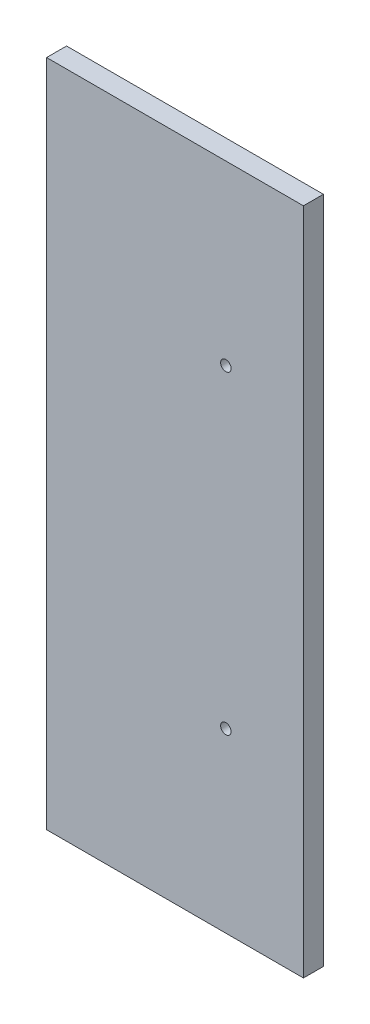
ISO-10303-21;
HEADER;
FILE_DESCRIPTION(('STEP AP214'),'2;1');
FILE_NAME('part.step','',(''),(''),'','','');
FILE_SCHEMA(('AUTOMOTIVE_DESIGN { 1 0 10303 214 1 1 1 1 }'));
ENDSEC;
DATA;
#1=APPLICATION_CONTEXT('core data for automotive mechanical design processes');
#2=APPLICATION_PROTOCOL_DEFINITION('international standard','automotive_design',2000,#1);
#3=PRODUCT_CONTEXT('',#1,'mechanical');
#4=PRODUCT('Part','Part','',(#3));
#5=PRODUCT_RELATED_PRODUCT_CATEGORY('part','',(#4));
#6=PRODUCT_DEFINITION_FORMATION('','',#4);
#7=PRODUCT_DEFINITION_CONTEXT('part definition',#1,'design');
#8=PRODUCT_DEFINITION('design','',#6,#7);
#9=PRODUCT_DEFINITION_SHAPE('','',#8);
#10=(LENGTH_UNIT() NAMED_UNIT(*) SI_UNIT(.MILLI.,.METRE.));
#11=(NAMED_UNIT(*) PLANE_ANGLE_UNIT() SI_UNIT($,.RADIAN.));
#12=(NAMED_UNIT(*) SI_UNIT($,.STERADIAN.) SOLID_ANGLE_UNIT());
#13=UNCERTAINTY_MEASURE_WITH_UNIT(LENGTH_MEASURE(1.E-05),#10,'distance_accuracy_value','');
#14=(GEOMETRIC_REPRESENTATION_CONTEXT(3) GLOBAL_UNCERTAINTY_ASSIGNED_CONTEXT((#13)) GLOBAL_UNIT_ASSIGNED_CONTEXT((#10,
#11,#12)) REPRESENTATION_CONTEXT('',''));
#15=CARTESIAN_POINT('',(0.,0.,0.));
#16=DIRECTION('',(0.,0.,1.));
#17=DIRECTION('',(1.,0.,0.));
#18=AXIS2_PLACEMENT_3D('',#15,#16,#17);
#19=CARTESIAN_POINT('',(-245.05,0.,19.05));
#20=DIRECTION('',(1.,0.,0.));
#21=DIRECTION('',(0.,0.,-1.));
#22=AXIS2_PLACEMENT_3D('',#19,#20,#21);
#23=PLANE('',#22);
#24=DIRECTION('',(0.,-1.,0.));
#25=VECTOR('',#24,1.);
#26=CARTESIAN_POINT('',(-245.05,0.,0.));
#27=LINE('',#26,#25);
#28=CARTESIAN_POINT('',(-245.05,0.,0.));
#29=VERTEX_POINT('',#28);
#30=CARTESIAN_POINT('',(-245.05,-638.1,0.));
#31=VERTEX_POINT('',#30);
#32=EDGE_CURVE('E97',#29,#31,#27,.T.);
#33=ORIENTED_EDGE('',*,*,#32,.T.);
#34=DIRECTION('',(0.,0.,-1.));
#35=VECTOR('',#34,1.);
#36=CARTESIAN_POINT('',(-245.05,-638.1,19.05));
#37=LINE('',#36,#35);
#38=CARTESIAN_POINT('',(-245.05,-638.1,19.05));
#39=VERTEX_POINT('',#38);
#40=EDGE_CURVE('E11',#39,#31,#37,.T.);
#41=ORIENTED_EDGE('',*,*,#40,.F.);
#42=DIRECTION('',(0.,-1.,0.));
#43=VECTOR('',#42,1.);
#44=CARTESIAN_POINT('',(-245.05,0.,19.05));
#45=LINE('',#44,#43);
#46=CARTESIAN_POINT('',(-245.05,0.,19.05));
#47=VERTEX_POINT('',#46);
#48=EDGE_CURVE('E84',#47,#39,#45,.T.);
#49=ORIENTED_EDGE('',*,*,#48,.F.);
#50=DIRECTION('',(0.,0.,-1.));
#51=VECTOR('',#50,1.);
#52=CARTESIAN_POINT('',(-245.05,0.,19.05));
#53=LINE('',#52,#51);
#54=EDGE_CURVE('E93',#47,#29,#53,.T.);
#55=ORIENTED_EDGE('',*,*,#54,.T.);
#56=EDGE_LOOP('',(#33,#41,#49,#55));
#57=FACE_BOUND('',#56,.T.);
#58=ADVANCED_FACE('F32',(#57),#23,.F.);
#59=CARTESIAN_POINT('',(-245.05,-638.1,19.05));
#60=DIRECTION('',(0.,1.,0.));
#61=DIRECTION('',(0.,0.,1.));
#62=AXIS2_PLACEMENT_3D('',#59,#60,#61);
#63=PLANE('',#62);
#64=DIRECTION('',(1.,0.,0.));
#65=VECTOR('',#64,1.);
#66=CARTESIAN_POINT('',(-245.05,-638.1,0.));
#67=LINE('',#66,#65);
#68=CARTESIAN_POINT('',(0.,-638.1,0.));
#69=VERTEX_POINT('',#68);
#70=EDGE_CURVE('E88',#31,#69,#67,.T.);
#71=ORIENTED_EDGE('',*,*,#70,.T.);
#72=DIRECTION('',(0.,0.,-1.));
#73=VECTOR('',#72,1.);
#74=CARTESIAN_POINT('',(0.,-638.1,19.05));
#75=LINE('',#74,#73);
#76=CARTESIAN_POINT('',(0.,-638.1,19.05));
#77=VERTEX_POINT('',#76);
#78=EDGE_CURVE('E41',#77,#69,#75,.T.);
#79=ORIENTED_EDGE('',*,*,#78,.F.);
#80=DIRECTION('',(1.,0.,0.));
#81=VECTOR('',#80,1.);
#82=CARTESIAN_POINT('',(-245.05,-638.1,19.05));
#83=LINE('',#82,#81);
#84=EDGE_CURVE('E79',#39,#77,#83,.T.);
#85=ORIENTED_EDGE('',*,*,#84,.F.);
#86=ORIENTED_EDGE('',*,*,#40,.T.);
#87=EDGE_LOOP('',(#71,#79,#85,#86));
#88=FACE_BOUND('',#87,.T.);
#89=ADVANCED_FACE('F87',(#88),#63,.F.);
#90=CARTESIAN_POINT('',(0.,0.,19.05));
#91=DIRECTION('',(-1.,0.,0.));
#92=DIRECTION('',(0.,0.,1.));
#93=AXIS2_PLACEMENT_3D('',#90,#91,#92);
#94=PLANE('',#93);
#95=DIRECTION('',(0.,1.,0.));
#96=VECTOR('',#95,1.);
#97=CARTESIAN_POINT('',(0.,0.,0.));
#98=LINE('',#97,#96);
#99=CARTESIAN_POINT('',(0.,0.,0.));
#100=VERTEX_POINT('',#99);
#101=EDGE_CURVE('E66',#69,#100,#98,.T.);
#102=ORIENTED_EDGE('',*,*,#101,.T.);
#103=DIRECTION('',(0.,0.,-1.));
#104=VECTOR('',#103,1.);
#105=CARTESIAN_POINT('',(0.,0.,19.05));
#106=LINE('',#105,#104);
#107=CARTESIAN_POINT('',(0.,0.,19.05));
#108=VERTEX_POINT('',#107);
#109=EDGE_CURVE('E89',#108,#100,#106,.T.);
#110=ORIENTED_EDGE('',*,*,#109,.F.);
#111=DIRECTION('',(0.,1.,0.));
#112=VECTOR('',#111,1.);
#113=CARTESIAN_POINT('',(0.,0.,19.05));
#114=LINE('',#113,#112);
#115=EDGE_CURVE('E82',#77,#108,#114,.T.);
#116=ORIENTED_EDGE('',*,*,#115,.F.);
#117=ORIENTED_EDGE('',*,*,#78,.T.);
#118=EDGE_LOOP('',(#102,#110,#116,#117));
#119=FACE_BOUND('',#118,.T.);
#120=ADVANCED_FACE('F91',(#119),#94,.F.);
#121=CARTESIAN_POINT('',(-245.05,0.,19.05));
#122=DIRECTION('',(0.,-1.,0.));
#123=DIRECTION('',(0.,0.,-1.));
#124=AXIS2_PLACEMENT_3D('',#121,#122,#123);
#125=PLANE('',#124);
#126=DIRECTION('',(-1.,0.,0.));
#127=VECTOR('',#126,1.);
#128=CARTESIAN_POINT('',(-245.05,0.,0.));
#129=LINE('',#128,#127);
#130=EDGE_CURVE('E72',#100,#29,#129,.T.);
#131=ORIENTED_EDGE('',*,*,#130,.T.);
#132=ORIENTED_EDGE('',*,*,#54,.F.);
#133=DIRECTION('',(-1.,0.,0.));
#134=VECTOR('',#133,1.);
#135=CARTESIAN_POINT('',(-245.05,0.,19.05));
#136=LINE('',#135,#134);
#137=EDGE_CURVE('E49',#108,#47,#136,.T.);
#138=ORIENTED_EDGE('',*,*,#137,.F.);
#139=ORIENTED_EDGE('',*,*,#109,.T.);
#140=EDGE_LOOP('',(#131,#132,#138,#139));
#141=FACE_BOUND('',#140,.T.);
#142=ADVANCED_FACE('F104',(#141),#125,.F.);
#143=CARTESIAN_POINT('',(0.,0.,19.05));
#144=DIRECTION('',(0.,0.,1.));
#145=DIRECTION('',(1.,0.,0.));
#146=AXIS2_PLACEMENT_3D('',#143,#144,#145);
#147=PLANE('',#146);
#148=CARTESIAN_POINT('',(-74.,-469.05,19.05));
#149=DIRECTION('',(0.,0.,1.));
#150=DIRECTION('',(1.,0.,0.));
#151=AXIS2_PLACEMENT_3D('',#148,#149,#150);
#152=CIRCLE('',#151,5.);
#153=CARTESIAN_POINT('',(-68.9999999999999,-469.05,19.05));
#154=VERTEX_POINT('',#153);
#155=EDGE_CURVE('E113',#154,#154,#152,.T.);
#156=ORIENTED_EDGE('',*,*,#155,.F.);
#157=EDGE_LOOP('',(#156));
#158=FACE_BOUND('',#157,.T.);
#159=CARTESIAN_POINT('',(-74.,-169.05,19.05));
#160=DIRECTION('',(0.,0.,1.));
#161=DIRECTION('',(1.,0.,0.));
#162=AXIS2_PLACEMENT_3D('',#159,#160,#161);
#163=CIRCLE('',#162,5.);
#164=CARTESIAN_POINT('',(-68.9999999999999,-169.05,19.05));
#165=VERTEX_POINT('',#164);
#166=EDGE_CURVE('E35',#165,#165,#163,.T.);
#167=ORIENTED_EDGE('',*,*,#166,.F.);
#168=EDGE_LOOP('',(#167));
#169=FACE_BOUND('',#168,.T.);
#170=ORIENTED_EDGE('',*,*,#48,.T.);
#171=ORIENTED_EDGE('',*,*,#84,.T.);
#172=ORIENTED_EDGE('',*,*,#115,.T.);
#173=ORIENTED_EDGE('',*,*,#137,.T.);
#174=EDGE_LOOP('',(#170,#171,#172,#173));
#175=FACE_BOUND('',#174,.T.);
#176=ADVANCED_FACE('F80',(#158,#169,#175),#147,.T.);
#177=CARTESIAN_POINT('',(0.,0.,0.));
#178=DIRECTION('',(0.,0.,1.));
#179=DIRECTION('',(1.,0.,0.));
#180=AXIS2_PLACEMENT_3D('',#177,#178,#179);
#181=PLANE('',#180);
#182=CARTESIAN_POINT('',(-74.,-469.05,0.));
#183=DIRECTION('',(0.,0.,-1.));
#184=DIRECTION('',(-1.,0.,0.));
#185=AXIS2_PLACEMENT_3D('',#182,#183,#184);
#186=CIRCLE('',#185,5.);
#187=CARTESIAN_POINT('',(-79.,-469.05,0.));
#188=VERTEX_POINT('',#187);
#189=EDGE_CURVE('E116',#188,#188,#186,.T.);
#190=ORIENTED_EDGE('',*,*,#189,.F.);
#191=EDGE_LOOP('',(#190));
#192=FACE_BOUND('',#191,.T.);
#193=CARTESIAN_POINT('',(-74.,-169.05,0.));
#194=DIRECTION('',(0.,0.,-1.));
#195=DIRECTION('',(-1.,0.,0.));
#196=AXIS2_PLACEMENT_3D('',#193,#194,#195);
#197=CIRCLE('',#196,5.);
#198=CARTESIAN_POINT('',(-79.,-169.05,0.));
#199=VERTEX_POINT('',#198);
#200=EDGE_CURVE('E110',#199,#199,#197,.T.);
#201=ORIENTED_EDGE('',*,*,#200,.F.);
#202=EDGE_LOOP('',(#201));
#203=FACE_BOUND('',#202,.T.);
#204=ORIENTED_EDGE('',*,*,#32,.F.);
#205=ORIENTED_EDGE('',*,*,#130,.F.);
#206=ORIENTED_EDGE('',*,*,#101,.F.);
#207=ORIENTED_EDGE('',*,*,#70,.F.);
#208=EDGE_LOOP('',(#204,#205,#206,#207));
#209=FACE_BOUND('',#208,.T.);
#210=ADVANCED_FACE('F107',(#192,#203,#209),#181,.F.);
#211=CARTESIAN_POINT('',(-74.,-169.05,0.));
#212=DIRECTION('',(0.,0.,-1.));
#213=DIRECTION('',(-1.,0.,0.));
#214=AXIS2_PLACEMENT_3D('',#211,#212,#213);
#215=CYLINDRICAL_SURFACE('',#214,5.);
#216=ORIENTED_EDGE('',*,*,#166,.T.);
#217=EDGE_LOOP('',(#216));
#218=FACE_BOUND('',#217,.T.);
#219=ORIENTED_EDGE('',*,*,#200,.T.);
#220=EDGE_LOOP('',(#219));
#221=FACE_BOUND('',#220,.T.);
#222=ADVANCED_FACE('F124',(#218,#221),#215,.F.);
#223=CARTESIAN_POINT('',(-74.,-469.05,0.));
#224=DIRECTION('',(0.,0.,-1.));
#225=DIRECTION('',(-1.,0.,0.));
#226=AXIS2_PLACEMENT_3D('',#223,#224,#225);
#227=CYLINDRICAL_SURFACE('',#226,5.);
#228=ORIENTED_EDGE('',*,*,#155,.T.);
#229=EDGE_LOOP('',(#228));
#230=FACE_BOUND('',#229,.T.);
#231=ORIENTED_EDGE('',*,*,#189,.T.);
#232=EDGE_LOOP('',(#231));
#233=FACE_BOUND('',#232,.T.);
#234=ADVANCED_FACE('F120',(#230,#233),#227,.F.);
#235=CLOSED_SHELL('',(#58,#89,#120,#142,#176,#210,#222,#234));
#236=MANIFOLD_SOLID_BREP('B2',#235);
#237=ADVANCED_BREP_SHAPE_REPRESENTATION('',(#18,#236),#14);
#238=SHAPE_DEFINITION_REPRESENTATION(#9,#237);
ENDSEC;
END-ISO-10303-21;
